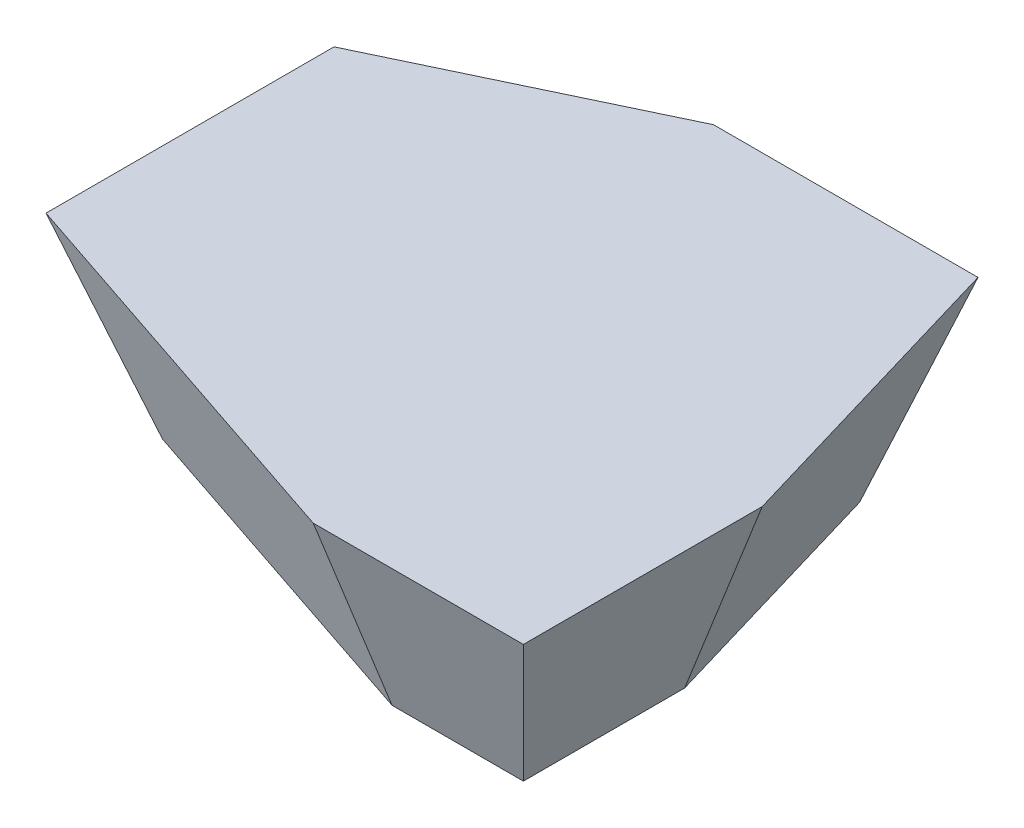
ISO-10303-21;
HEADER;
FILE_DESCRIPTION(('STEP AP214'),'2;1');
FILE_NAME('part.step','',(''),(''),'','','');
FILE_SCHEMA(('AUTOMOTIVE_DESIGN { 1 0 10303 214 1 1 1 1 }'));
ENDSEC;
DATA;
#1=APPLICATION_CONTEXT('core data for automotive mechanical design processes');
#2=APPLICATION_PROTOCOL_DEFINITION('international standard','automotive_design',2000,#1);
#3=PRODUCT_CONTEXT('',#1,'mechanical');
#4=PRODUCT('Part','Part','',(#3));
#5=PRODUCT_RELATED_PRODUCT_CATEGORY('part','',(#4));
#6=PRODUCT_DEFINITION_FORMATION('','',#4);
#7=PRODUCT_DEFINITION_CONTEXT('part definition',#1,'design');
#8=PRODUCT_DEFINITION('design','',#6,#7);
#9=PRODUCT_DEFINITION_SHAPE('','',#8);
#10=(LENGTH_UNIT() NAMED_UNIT(*) SI_UNIT(.MILLI.,.METRE.));
#11=(NAMED_UNIT(*) PLANE_ANGLE_UNIT() SI_UNIT($,.RADIAN.));
#12=(NAMED_UNIT(*) SI_UNIT($,.STERADIAN.) SOLID_ANGLE_UNIT());
#13=UNCERTAINTY_MEASURE_WITH_UNIT(LENGTH_MEASURE(1.E-05),#10,'distance_accuracy_value','');
#14=(GEOMETRIC_REPRESENTATION_CONTEXT(3) GLOBAL_UNCERTAINTY_ASSIGNED_CONTEXT((#13)) GLOBAL_UNIT_ASSIGNED_CONTEXT((#10,
#11,#12)) REPRESENTATION_CONTEXT('',''));
#15=CARTESIAN_POINT('',(0.,0.,0.));
#16=DIRECTION('',(0.,0.,1.));
#17=DIRECTION('',(1.,0.,0.));
#18=AXIS2_PLACEMENT_3D('',#15,#16,#17);
#19=CARTESIAN_POINT('',(2.35947235800346,0.,26.9330233390706));
#20=DIRECTION('',(0.939692620785908,-0.342020143325669,0.));
#21=DIRECTION('',(0.342020143325669,0.939692620785908,0.));
#22=AXIS2_PLACEMENT_3D('',#19,#20,#21);
#23=PLANE('',#22);
#24=DIRECTION('',(0.,0.,-1.));
#25=VECTOR('',#24,1.);
#26=CARTESIAN_POINT('',(2.35947235800346,0.,26.9330233390706));
#27=LINE('',#26,#25);
#28=CARTESIAN_POINT('',(2.35947235800346,0.,26.9330233390706));
#29=VERTEX_POINT('',#28);
#30=CARTESIAN_POINT('',(2.35947235800346,0.,5.27554065404474));
#31=VERTEX_POINT('',#30);
#32=EDGE_CURVE('E142',#29,#31,#27,.T.);
#33=ORIENTED_EDGE('',*,*,#32,.T.);
#34=DIRECTION('',(-0.341602008199421,-0.938543803968259,0.0494327424579429));
#35=VECTOR('',#34,1.);
#36=CARTESIAN_POINT('',(2.35947235800346,0.,5.27554065404474));
#37=LINE('',#36,#35);
#38=CARTESIAN_POINT('',(11.4587282146585,25.,3.95880023529881));
#39=VERTEX_POINT('',#38);
#40=EDGE_CURVE('E11',#39,#31,#37,.T.);
#41=ORIENTED_EDGE('',*,*,#40,.F.);
#42=DIRECTION('',(0.,0.,1.));
#43=VECTOR('',#42,1.);
#44=CARTESIAN_POINT('',(11.4587282146585,25.,26.9330233390706));
#45=LINE('',#44,#43);
#46=CARTESIAN_POINT('',(11.4587282146585,25.,36.0322791957256));
#47=VERTEX_POINT('',#46);
#48=EDGE_CURVE('E102',#47,#39,#45,.F.);
#49=ORIENTED_EDGE('',*,*,#48,.F.);
#50=DIRECTION('',(-0.323615577118185,-0.889126490715988,-0.323615577118185));
#51=VECTOR('',#50,1.);
#52=CARTESIAN_POINT('',(2.35947235800346,0.,26.9330233390706));
#53=LINE('',#52,#51);
#54=EDGE_CURVE('E98',#47,#29,#53,.T.);
#55=ORIENTED_EDGE('',*,*,#54,.T.);
#56=EDGE_LOOP('',(#33,#41,#49,#55));
#57=FACE_BOUND('',#56,.T.);
#58=ADVANCED_FACE('F35',(#57),#23,.T.);
#59=CARTESIAN_POINT('',(2.35947235800346,0.,5.27554065404474));
#60=DIRECTION('',(0.901144436334328,-0.342020143325669,-0.266384921538691));
#61=DIRECTION('',(0.354841735492282,0.934926383600776,0.));
#62=AXIS2_PLACEMENT_3D('',#59,#60,#61);
#63=PLANE('',#62);
#64=DIRECTION('',(-0.283480912424215,0.,-0.958977878937327));
#65=VECTOR('',#64,1.);
#66=CARTESIAN_POINT('',(2.35947235800346,0.,5.27554065404474));
#67=LINE('',#66,#65);
#68=CARTESIAN_POINT('',(-7.49682092943199,0.,-28.0669766609294));
#69=VERTEX_POINT('',#68);
#70=EDGE_CURVE('E139',#31,#69,#67,.T.);
#71=ORIENTED_EDGE('',*,*,#70,.T.);
#72=DIRECTION('',(-0.247590525376588,-0.910435069669375,0.33137126559173));
#73=VECTOR('',#72,1.);
#74=CARTESIAN_POINT('',(-7.49682092943199,0.,-28.0669766609294));
#75=LINE('',#74,#73);
#76=CARTESIAN_POINT('',(-0.698133861432157,25.,-37.1662325175845));
#77=VERTEX_POINT('',#76);
#78=EDGE_CURVE('E45',#77,#69,#75,.T.);
#79=ORIENTED_EDGE('',*,*,#78,.F.);
#80=DIRECTION('',(0.283480912424215,0.,0.958977878937327));
#81=VECTOR('',#80,1.);
#82=CARTESIAN_POINT('',(11.0854574393266,25.,2.69607530141878));
#83=LINE('',#82,#81);
#84=EDGE_CURVE('E104',#39,#77,#83,.F.);
#85=ORIENTED_EDGE('',*,*,#84,.F.);
#86=ORIENTED_EDGE('',*,*,#40,.T.);
#87=EDGE_LOOP('',(#71,#79,#85,#86));
#88=FACE_BOUND('',#87,.T.);
#89=ADVANCED_FACE('F167',(#88),#63,.T.);
#90=CARTESIAN_POINT('',(-7.49682092943199,0.,-28.0669766609294));
#91=DIRECTION('',(0.,-0.342020143325669,-0.939692620785908));
#92=DIRECTION('',(0.,0.939692620785908,-0.342020143325669));
#93=AXIS2_PLACEMENT_3D('',#90,#91,#92);
#94=PLANE('',#93);
#95=DIRECTION('',(-1.,0.,0.));
#96=VECTOR('',#95,1.);
#97=CARTESIAN_POINT('',(-7.49682092943199,0.,-28.0669766609294));
#98=LINE('',#97,#96);
#99=CARTESIAN_POINT('',(-34.1521842340792,0.,-28.0669766609294));
#100=VERTEX_POINT('',#99);
#101=EDGE_CURVE('E119',#69,#100,#98,.T.);
#102=ORIENTED_EDGE('',*,*,#101,.T.);
#103=DIRECTION('',(0.0769601541283956,-0.936905651527177,0.341005769471676));
#104=VECTOR('',#103,1.);
#105=CARTESIAN_POINT('',(-34.1521842340792,0.,-28.0669766609294));
#106=LINE('',#105,#104);
#107=CARTESIAN_POINT('',(-36.2057569178107,25.,-37.1662325175845));
#108=VERTEX_POINT('',#107);
#109=EDGE_CURVE('E115',#108,#100,#106,.T.);
#110=ORIENTED_EDGE('',*,*,#109,.F.);
#111=DIRECTION('',(1.,0.,0.));
#112=VECTOR('',#111,1.);
#113=CARTESIAN_POINT('',(-7.49682092943199,25.,-37.1662325175845));
#114=LINE('',#113,#112);
#115=EDGE_CURVE('E107',#77,#108,#114,.F.);
#116=ORIENTED_EDGE('',*,*,#115,.F.);
#117=ORIENTED_EDGE('',*,*,#78,.T.);
#118=EDGE_LOOP('',(#102,#110,#116,#117));
#119=FACE_BOUND('',#118,.T.);
#120=ADVANCED_FACE('F116',(#119),#94,.T.);
#121=CARTESIAN_POINT('',(-34.1521842340792,0.,-28.0669766609294));
#122=DIRECTION('',(-0.403593851440541,-0.342020143325669,-0.848607226364988));
#123=DIRECTION('',(-0.903068947860056,0.,0.42949560581097));
#124=AXIS2_PLACEMENT_3D('',#121,#122,#123);
#125=PLANE('',#124);
#126=DIRECTION('',(-0.903068947860056,0.,0.42949560581097));
#127=VECTOR('',#126,1.);
#128=CARTESIAN_POINT('',(-34.1521842340792,0.,-28.0669766609294));
#129=LINE('',#128,#127);
#130=CARTESIAN_POINT('',(-61.6405276419965,0.,-14.993641858864));
#131=VERTEX_POINT('',#130);
#132=EDGE_CURVE('E126',#100,#131,#129,.T.);
#133=ORIENTED_EDGE('',*,*,#132,.T.);
#134=DIRECTION('',(0.334305587972031,-0.918497054150653,0.211194070388462));
#135=VECTOR('',#134,1.);
#136=CARTESIAN_POINT('',(-61.6405276419965,0.,-14.993641858864));
#137=LINE('',#136,#135);
#138=CARTESIAN_POINT('',(-70.7397834986516,25.,-20.742001895352));
#139=VERTEX_POINT('',#138);
#140=EDGE_CURVE('E92',#139,#131,#137,.T.);
#141=ORIENTED_EDGE('',*,*,#140,.F.);
#142=DIRECTION('',(0.903068947860056,0.,-0.42949560581097));
#143=VECTOR('',#142,1.);
#144=CARTESIAN_POINT('',(-38.0602746406623,25.,-36.2842320737084));
#145=LINE('',#144,#143);
#146=EDGE_CURVE('E72',#108,#139,#145,.F.);
#147=ORIENTED_EDGE('',*,*,#146,.F.);
#148=ORIENTED_EDGE('',*,*,#109,.T.);
#149=EDGE_LOOP('',(#133,#141,#147,#148));
#150=FACE_BOUND('',#149,.T.);
#151=ADVANCED_FACE('F124',(#150),#125,.T.);
#152=CARTESIAN_POINT('',(-61.6405276419965,0.,-14.993641858864));
#153=DIRECTION('',(-0.939692620785908,-0.342020143325669,0.));
#154=DIRECTION('',(0.342020143325669,-0.939692620785908,0.));
#155=AXIS2_PLACEMENT_3D('',#152,#153,#154);
#156=PLANE('',#155);
#157=DIRECTION('',(0.,0.,1.));
#158=VECTOR('',#157,1.);
#159=CARTESIAN_POINT('',(-61.6405276419965,0.,-14.993641858864));
#160=LINE('',#159,#158);
#161=CARTESIAN_POINT('',(-61.6405276419965,0.,11.3840614113597));
#162=VERTEX_POINT('',#161);
#163=EDGE_CURVE('E88',#131,#162,#160,.T.);
#164=ORIENTED_EDGE('',*,*,#163,.T.);
#165=DIRECTION('',(0.332114808287991,-0.912477936437755,-0.238922099501338));
#166=VECTOR('',#165,1.);
#167=CARTESIAN_POINT('',(-61.6405276419965,0.,11.3840614113597));
#168=LINE('',#167,#166);
#169=CARTESIAN_POINT('',(-70.7397834986516,25.,17.9300306332039));
#170=VERTEX_POINT('',#169);
#171=EDGE_CURVE('E84',#170,#162,#168,.T.);
#172=ORIENTED_EDGE('',*,*,#171,.F.);
#173=DIRECTION('',(0.,0.,-1.));
#174=VECTOR('',#173,1.);
#175=CARTESIAN_POINT('',(-70.7397834986516,25.,-14.993641858864));
#176=LINE('',#175,#174);
#177=EDGE_CURVE('E39',#139,#170,#176,.F.);
#178=ORIENTED_EDGE('',*,*,#177,.F.);
#179=ORIENTED_EDGE('',*,*,#140,.T.);
#180=EDGE_LOOP('',(#164,#172,#178,#179));
#181=FACE_BOUND('',#180,.T.);
#182=ADVANCED_FACE('F85',(#181),#156,.T.);
#183=CARTESIAN_POINT('',(-61.6405276419965,0.,11.3840614113597));
#184=DIRECTION('',(-0.298756902721576,-0.342020143325669,0.890935763473271));
#185=DIRECTION('',(0.,-0.933572732461952,-0.358387992549311));
#186=AXIS2_PLACEMENT_3D('',#183,#184,#185);
#187=PLANE('',#186);
#188=DIRECTION('',(0.948114036192111,0.,0.317930455250049));
#189=VECTOR('',#188,1.);
#190=CARTESIAN_POINT('',(-61.6405276419965,0.,11.3840614113597));
#191=LINE('',#190,#189);
#192=CARTESIAN_POINT('',(-15.2713018932874,0.,26.9330233390706));
#193=VERTEX_POINT('',#192);
#194=EDGE_CURVE('E147',#162,#193,#191,.T.);
#195=ORIENTED_EDGE('',*,*,#194,.T.);
#196=DIRECTION('',(0.0557306300971167,-0.938232188787395,-0.341488589549041));
#197=VECTOR('',#196,1.);
#198=CARTESIAN_POINT('',(-15.2713018932874,0.,26.9330233390706));
#199=LINE('',#198,#197);
#200=CARTESIAN_POINT('',(-16.7562922497029,25.,36.0322791957256));
#201=VERTEX_POINT('',#200);
#202=EDGE_CURVE('E93',#201,#193,#199,.T.);
#203=ORIENTED_EDGE('',*,*,#202,.F.);
#204=DIRECTION('',(-0.948114036192111,0.,-0.317930455250049));
#205=VECTOR('',#204,1.);
#206=CARTESIAN_POINT('',(-64.5334581989396,25.,20.0111936079577));
#207=LINE('',#206,#205);
#208=EDGE_CURVE('E78',#170,#201,#207,.F.);
#209=ORIENTED_EDGE('',*,*,#208,.F.);
#210=ORIENTED_EDGE('',*,*,#171,.T.);
#211=EDGE_LOOP('',(#195,#203,#209,#210));
#212=FACE_BOUND('',#211,.T.);
#213=ADVANCED_FACE('F95',(#212),#187,.T.);
#214=CARTESIAN_POINT('',(-15.2713018932874,0.,26.9330233390706));
#215=DIRECTION('',(0.,-0.342020143325669,0.939692620785908));
#216=DIRECTION('',(0.,-0.939692620785908,-0.342020143325669));
#217=AXIS2_PLACEMENT_3D('',#214,#215,#216);
#218=PLANE('',#217);
#219=DIRECTION('',(1.,0.,0.));
#220=VECTOR('',#219,1.);
#221=CARTESIAN_POINT('',(-15.2713018932874,0.,26.9330233390706));
#222=LINE('',#221,#220);
#223=EDGE_CURVE('E105',#193,#29,#222,.T.);
#224=ORIENTED_EDGE('',*,*,#223,.T.);
#225=ORIENTED_EDGE('',*,*,#54,.F.);
#226=DIRECTION('',(-1.,0.,0.));
#227=VECTOR('',#226,1.);
#228=CARTESIAN_POINT('',(-15.2713018932874,25.,36.0322791957256));
#229=LINE('',#228,#227);
#230=EDGE_CURVE('E54',#201,#47,#229,.F.);
#231=ORIENTED_EDGE('',*,*,#230,.F.);
#232=ORIENTED_EDGE('',*,*,#202,.T.);
#233=EDGE_LOOP('',(#224,#225,#231,#232));
#234=FACE_BOUND('',#233,.T.);
#235=ADVANCED_FACE('F37',(#234),#218,.T.);
#236=CARTESIAN_POINT('',(0.,25.,0.));
#237=DIRECTION('',(0.,1.,0.));
#238=DIRECTION('',(0.,0.,1.));
#239=AXIS2_PLACEMENT_3D('',#236,#237,#238);
#240=PLANE('',#239);
#241=ORIENTED_EDGE('',*,*,#48,.T.);
#242=ORIENTED_EDGE('',*,*,#84,.T.);
#243=ORIENTED_EDGE('',*,*,#115,.T.);
#244=ORIENTED_EDGE('',*,*,#146,.T.);
#245=ORIENTED_EDGE('',*,*,#177,.T.);
#246=ORIENTED_EDGE('',*,*,#208,.T.);
#247=ORIENTED_EDGE('',*,*,#230,.T.);
#248=EDGE_LOOP('',(#241,#242,#243,#244,#245,#246,#247));
#249=FACE_BOUND('',#248,.T.);
#250=ADVANCED_FACE('F76',(#249),#240,.T.);
#251=CARTESIAN_POINT('',(0.,0.,0.));
#252=DIRECTION('',(0.,1.,0.));
#253=DIRECTION('',(0.,0.,1.));
#254=AXIS2_PLACEMENT_3D('',#251,#252,#253);
#255=PLANE('',#254);
#256=ORIENTED_EDGE('',*,*,#32,.F.);
#257=ORIENTED_EDGE('',*,*,#223,.F.);
#258=ORIENTED_EDGE('',*,*,#194,.F.);
#259=ORIENTED_EDGE('',*,*,#163,.F.);
#260=ORIENTED_EDGE('',*,*,#132,.F.);
#261=ORIENTED_EDGE('',*,*,#101,.F.);
#262=ORIENTED_EDGE('',*,*,#70,.F.);
#263=EDGE_LOOP('',(#256,#257,#258,#259,#260,#261,#262));
#264=FACE_BOUND('',#263,.T.);
#265=ADVANCED_FACE('F138',(#264),#255,.F.);
#266=CLOSED_SHELL('',(#58,#89,#120,#151,#182,#213,#235,#250,#265));
#267=MANIFOLD_SOLID_BREP('B2',#266);
#268=ADVANCED_BREP_SHAPE_REPRESENTATION('',(#18,#267),#14);
#269=SHAPE_DEFINITION_REPRESENTATION(#9,#268);
ENDSEC;
END-ISO-10303-21;
